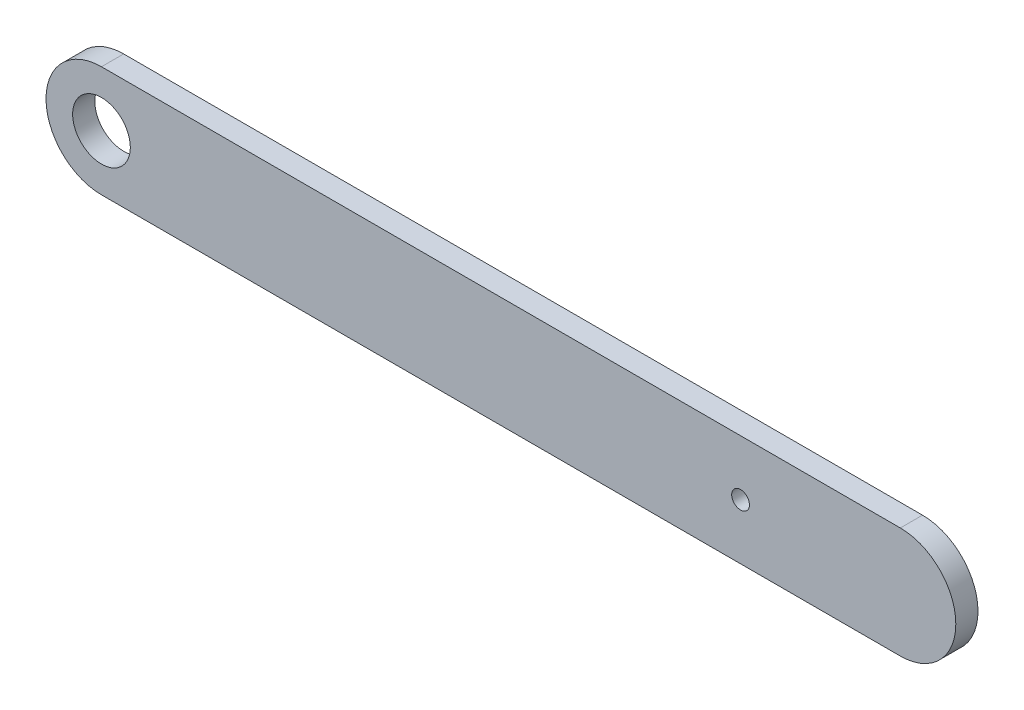
ISO-10303-21;
HEADER;
FILE_DESCRIPTION(('STEP AP214'),'2;1');
FILE_NAME('part.step','',(''),(''),'','','');
FILE_SCHEMA(('AUTOMOTIVE_DESIGN { 1 0 10303 214 1 1 1 1 }'));
ENDSEC;
DATA;
#1=APPLICATION_CONTEXT('core data for automotive mechanical design processes');
#2=APPLICATION_PROTOCOL_DEFINITION('international standard','automotive_design',2000,#1);
#3=PRODUCT_CONTEXT('',#1,'mechanical');
#4=PRODUCT('Part','Part','',(#3));
#5=PRODUCT_RELATED_PRODUCT_CATEGORY('part','',(#4));
#6=PRODUCT_DEFINITION_FORMATION('','',#4);
#7=PRODUCT_DEFINITION_CONTEXT('part definition',#1,'design');
#8=PRODUCT_DEFINITION('design','',#6,#7);
#9=PRODUCT_DEFINITION_SHAPE('','',#8);
#10=(LENGTH_UNIT() NAMED_UNIT(*) SI_UNIT(.MILLI.,.METRE.));
#11=(NAMED_UNIT(*) PLANE_ANGLE_UNIT() SI_UNIT($,.RADIAN.));
#12=(NAMED_UNIT(*) SI_UNIT($,.STERADIAN.) SOLID_ANGLE_UNIT());
#13=UNCERTAINTY_MEASURE_WITH_UNIT(LENGTH_MEASURE(1.E-05),#10,'distance_accuracy_value','');
#14=(GEOMETRIC_REPRESENTATION_CONTEXT(3) GLOBAL_UNCERTAINTY_ASSIGNED_CONTEXT((#13)) GLOBAL_UNIT_ASSIGNED_CONTEXT((#10,
#11,#12)) REPRESENTATION_CONTEXT('',''));
#15=CARTESIAN_POINT('',(0.,0.,0.));
#16=DIRECTION('',(0.,0.,1.));
#17=DIRECTION('',(1.,0.,0.));
#18=AXIS2_PLACEMENT_3D('',#15,#16,#17);
#19=CARTESIAN_POINT('',(0.,0.,5.));
#20=DIRECTION('',(0.,0.,1.));
#21=DIRECTION('',(1.,0.,0.));
#22=AXIS2_PLACEMENT_3D('',#19,#20,#21);
#23=PLANE('',#22);
#24=CARTESIAN_POINT('',(0.,0.,5.));
#25=DIRECTION('',(0.,0.,1.));
#26=DIRECTION('',(1.,0.,0.));
#27=AXIS2_PLACEMENT_3D('',#24,#25,#26);
#28=CIRCLE('',#27,6.5);
#29=CARTESIAN_POINT('',(6.5,0.,5.));
#30=VERTEX_POINT('',#29);
#31=EDGE_CURVE('E106',#30,#30,#28,.T.);
#32=ORIENTED_EDGE('',*,*,#31,.F.);
#33=EDGE_LOOP('',(#32));
#34=FACE_BOUND('',#33,.T.);
#35=CARTESIAN_POINT('',(0.,0.,5.));
#36=DIRECTION('',(0.,0.,1.));
#37=DIRECTION('',(1.,0.,0.));
#38=AXIS2_PLACEMENT_3D('',#35,#36,#37);
#39=CIRCLE('',#38,12.5);
#40=CARTESIAN_POINT('',(0.,12.5,5.));
#41=VERTEX_POINT('',#40);
#42=CARTESIAN_POINT('',(0.,-12.5,5.));
#43=VERTEX_POINT('',#42);
#44=EDGE_CURVE('E93',#41,#43,#39,.T.);
#45=ORIENTED_EDGE('',*,*,#44,.T.);
#46=DIRECTION('',(1.,0.,0.));
#47=VECTOR('',#46,1.);
#48=CARTESIAN_POINT('',(0.,-12.5,5.));
#49=LINE('',#48,#47);
#50=CARTESIAN_POINT('',(180.,-12.5,5.));
#51=VERTEX_POINT('',#50);
#52=EDGE_CURVE('E88',#43,#51,#49,.T.);
#53=ORIENTED_EDGE('',*,*,#52,.T.);
#54=CARTESIAN_POINT('',(180.,0.,5.));
#55=DIRECTION('',(0.,0.,1.));
#56=DIRECTION('',(1.,0.,0.));
#57=AXIS2_PLACEMENT_3D('',#54,#55,#56);
#58=CIRCLE('',#57,12.5);
#59=CARTESIAN_POINT('',(180.,12.5,5.));
#60=VERTEX_POINT('',#59);
#61=EDGE_CURVE('E90',#51,#60,#58,.T.);
#62=ORIENTED_EDGE('',*,*,#61,.T.);
#63=DIRECTION('',(-1.,0.,0.));
#64=VECTOR('',#63,1.);
#65=CARTESIAN_POINT('',(0.,12.5,5.));
#66=LINE('',#65,#64);
#67=EDGE_CURVE('E57',#60,#41,#66,.T.);
#68=ORIENTED_EDGE('',*,*,#67,.T.);
#69=EDGE_LOOP('',(#45,#53,#62,#68));
#70=FACE_BOUND('',#69,.T.);
#71=CARTESIAN_POINT('',(144.,0.,5.));
#72=DIRECTION('',(0.,0.,1.));
#73=DIRECTION('',(1.,0.,0.));
#74=AXIS2_PLACEMENT_3D('',#71,#72,#73);
#75=CIRCLE('',#74,2.00000000000011);
#76=CARTESIAN_POINT('',(146.,0.,5.));
#77=VERTEX_POINT('',#76);
#78=EDGE_CURVE('E122',#77,#77,#75,.T.);
#79=ORIENTED_EDGE('',*,*,#78,.F.);
#80=EDGE_LOOP('',(#79));
#81=FACE_BOUND('',#80,.T.);
#82=ADVANCED_FACE('F39',(#34,#70,#81),#23,.T.);
#83=CARTESIAN_POINT('',(0.,0.,0.));
#84=DIRECTION('',(0.,0.,1.));
#85=DIRECTION('',(1.,0.,0.));
#86=AXIS2_PLACEMENT_3D('',#83,#84,#85);
#87=PLANE('',#86);
#88=CARTESIAN_POINT('',(0.,0.,0.));
#89=DIRECTION('',(0.,0.,1.));
#90=DIRECTION('',(1.,0.,0.));
#91=AXIS2_PLACEMENT_3D('',#88,#89,#90);
#92=CIRCLE('',#91,12.5);
#93=CARTESIAN_POINT('',(0.,12.5,0.));
#94=VERTEX_POINT('',#93);
#95=CARTESIAN_POINT('',(0.,-12.5,0.));
#96=VERTEX_POINT('',#95);
#97=EDGE_CURVE('E103',#94,#96,#92,.T.);
#98=ORIENTED_EDGE('',*,*,#97,.F.);
#99=DIRECTION('',(-1.,0.,0.));
#100=VECTOR('',#99,1.);
#101=CARTESIAN_POINT('',(0.,12.5,0.));
#102=LINE('',#101,#100);
#103=CARTESIAN_POINT('',(180.,12.5,0.));
#104=VERTEX_POINT('',#103);
#105=EDGE_CURVE('E79',#104,#94,#102,.T.);
#106=ORIENTED_EDGE('',*,*,#105,.F.);
#107=CARTESIAN_POINT('',(180.,0.,0.));
#108=DIRECTION('',(0.,0.,1.));
#109=DIRECTION('',(1.,0.,0.));
#110=AXIS2_PLACEMENT_3D('',#107,#108,#109);
#111=CIRCLE('',#110,12.5);
#112=CARTESIAN_POINT('',(180.,-12.5,0.));
#113=VERTEX_POINT('',#112);
#114=EDGE_CURVE('E71',#113,#104,#111,.T.);
#115=ORIENTED_EDGE('',*,*,#114,.F.);
#116=DIRECTION('',(1.,0.,0.));
#117=VECTOR('',#116,1.);
#118=CARTESIAN_POINT('',(0.,-12.5,0.));
#119=LINE('',#118,#117);
#120=EDGE_CURVE('E92',#96,#113,#119,.T.);
#121=ORIENTED_EDGE('',*,*,#120,.F.);
#122=EDGE_LOOP('',(#98,#106,#115,#121));
#123=FACE_BOUND('',#122,.T.);
#124=CARTESIAN_POINT('',(0.,0.,0.));
#125=DIRECTION('',(0.,0.,1.));
#126=DIRECTION('',(1.,0.,0.));
#127=AXIS2_PLACEMENT_3D('',#124,#125,#126);
#128=CIRCLE('',#127,6.5);
#129=CARTESIAN_POINT('',(6.5,0.,0.));
#130=VERTEX_POINT('',#129);
#131=EDGE_CURVE('E116',#130,#130,#128,.T.);
#132=ORIENTED_EDGE('',*,*,#131,.T.);
#133=EDGE_LOOP('',(#132));
#134=FACE_BOUND('',#133,.T.);
#135=CARTESIAN_POINT('',(144.,0.,0.));
#136=DIRECTION('',(0.,0.,1.));
#137=DIRECTION('',(1.,0.,0.));
#138=AXIS2_PLACEMENT_3D('',#135,#136,#137);
#139=CIRCLE('',#138,2.00000000000011);
#140=CARTESIAN_POINT('',(146.,0.,0.));
#141=VERTEX_POINT('',#140);
#142=EDGE_CURVE('E124',#141,#141,#139,.T.);
#143=ORIENTED_EDGE('',*,*,#142,.T.);
#144=EDGE_LOOP('',(#143));
#145=FACE_BOUND('',#144,.T.);
#146=ADVANCED_FACE('F111',(#123,#134,#145),#87,.F.);
#147=CARTESIAN_POINT('',(0.,0.,5.));
#148=DIRECTION('',(0.,0.,-1.));
#149=DIRECTION('',(-1.,0.,0.));
#150=AXIS2_PLACEMENT_3D('',#147,#148,#149);
#151=CYLINDRICAL_SURFACE('',#150,12.5);
#152=ORIENTED_EDGE('',*,*,#97,.T.);
#153=DIRECTION('',(0.,0.,-1.));
#154=VECTOR('',#153,1.);
#155=CARTESIAN_POINT('',(0.,-12.5,5.));
#156=LINE('',#155,#154);
#157=EDGE_CURVE('E11',#43,#96,#156,.T.);
#158=ORIENTED_EDGE('',*,*,#157,.F.);
#159=ORIENTED_EDGE('',*,*,#44,.F.);
#160=DIRECTION('',(0.,0.,-1.));
#161=VECTOR('',#160,1.);
#162=CARTESIAN_POINT('',(0.,12.5,5.));
#163=LINE('',#162,#161);
#164=EDGE_CURVE('E97',#41,#94,#163,.T.);
#165=ORIENTED_EDGE('',*,*,#164,.T.);
#166=EDGE_LOOP('',(#152,#158,#159,#165));
#167=FACE_BOUND('',#166,.T.);
#168=ADVANCED_FACE('F41',(#167),#151,.T.);
#169=CARTESIAN_POINT('',(0.,-12.5,5.));
#170=DIRECTION('',(0.,1.,0.));
#171=DIRECTION('',(-1.,0.,0.));
#172=AXIS2_PLACEMENT_3D('',#169,#170,#171);
#173=PLANE('',#172);
#174=CARTESIAN_POINT('',(175.,-12.5,2.5));
#175=DIRECTION('',(0.,-1.,0.));
#176=DIRECTION('',(0.,0.,-1.));
#177=AXIS2_PLACEMENT_3D('',#174,#175,#176);
#178=CIRCLE('',#177,1.59999999999999);
#179=CARTESIAN_POINT('',(175.,-12.5,0.900000000000009));
#180=VERTEX_POINT('',#179);
#181=EDGE_CURVE('E128',#180,#180,#178,.T.);
#182=ORIENTED_EDGE('',*,*,#181,.F.);
#183=EDGE_LOOP('',(#182));
#184=FACE_BOUND('',#183,.T.);
#185=ORIENTED_EDGE('',*,*,#120,.T.);
#186=DIRECTION('',(0.,0.,-1.));
#187=VECTOR('',#186,1.);
#188=CARTESIAN_POINT('',(180.,-12.5,5.));
#189=LINE('',#188,#187);
#190=EDGE_CURVE('E48',#51,#113,#189,.T.);
#191=ORIENTED_EDGE('',*,*,#190,.F.);
#192=ORIENTED_EDGE('',*,*,#52,.F.);
#193=ORIENTED_EDGE('',*,*,#157,.T.);
#194=EDGE_LOOP('',(#185,#191,#192,#193));
#195=FACE_BOUND('',#194,.T.);
#196=ADVANCED_FACE('F94',(#184,#195),#173,.F.);
#197=CARTESIAN_POINT('',(180.,0.,5.));
#198=DIRECTION('',(0.,0.,-1.));
#199=DIRECTION('',(-1.,0.,0.));
#200=AXIS2_PLACEMENT_3D('',#197,#198,#199);
#201=CYLINDRICAL_SURFACE('',#200,12.5);
#202=ORIENTED_EDGE('',*,*,#114,.T.);
#203=DIRECTION('',(0.,0.,-1.));
#204=VECTOR('',#203,1.);
#205=CARTESIAN_POINT('',(180.,12.5,5.));
#206=LINE('',#205,#204);
#207=EDGE_CURVE('E96',#60,#104,#206,.T.);
#208=ORIENTED_EDGE('',*,*,#207,.F.);
#209=ORIENTED_EDGE('',*,*,#61,.F.);
#210=ORIENTED_EDGE('',*,*,#190,.T.);
#211=EDGE_LOOP('',(#202,#208,#209,#210));
#212=FACE_BOUND('',#211,.T.);
#213=ADVANCED_FACE('F100',(#212),#201,.T.);
#214=CARTESIAN_POINT('',(0.,12.5,5.));
#215=DIRECTION('',(0.,-1.,0.));
#216=DIRECTION('',(1.,0.,0.));
#217=AXIS2_PLACEMENT_3D('',#214,#215,#216);
#218=PLANE('',#217);
#219=ORIENTED_EDGE('',*,*,#105,.T.);
#220=ORIENTED_EDGE('',*,*,#164,.F.);
#221=ORIENTED_EDGE('',*,*,#67,.F.);
#222=ORIENTED_EDGE('',*,*,#207,.T.);
#223=EDGE_LOOP('',(#219,#220,#221,#222));
#224=FACE_BOUND('',#223,.T.);
#225=ADVANCED_FACE('F112',(#224),#218,.F.);
#226=CARTESIAN_POINT('',(0.,0.,5.));
#227=DIRECTION('',(0.,0.,-1.));
#228=DIRECTION('',(-1.,0.,0.));
#229=AXIS2_PLACEMENT_3D('',#226,#227,#228);
#230=CYLINDRICAL_SURFACE('',#229,6.5);
#231=ORIENTED_EDGE('',*,*,#31,.T.);
#232=EDGE_LOOP('',(#231));
#233=FACE_BOUND('',#232,.T.);
#234=ORIENTED_EDGE('',*,*,#131,.F.);
#235=EDGE_LOOP('',(#234));
#236=FACE_BOUND('',#235,.T.);
#237=ADVANCED_FACE('F161',(#233,#236),#230,.F.);
#238=CARTESIAN_POINT('',(144.,0.,5.));
#239=DIRECTION('',(0.,0.,-1.));
#240=DIRECTION('',(-1.,0.,0.));
#241=AXIS2_PLACEMENT_3D('',#238,#239,#240);
#242=CYLINDRICAL_SURFACE('',#241,2.00000000000011);
#243=ORIENTED_EDGE('',*,*,#78,.T.);
#244=EDGE_LOOP('',(#243));
#245=FACE_BOUND('',#244,.T.);
#246=ORIENTED_EDGE('',*,*,#142,.F.);
#247=EDGE_LOOP('',(#246));
#248=FACE_BOUND('',#247,.T.);
#249=ADVANCED_FACE('F143',(#245,#248),#242,.F.);
#250=CARTESIAN_POINT('',(175.,-2.5,2.5));
#251=DIRECTION('',(0.,-1.,0.));
#252=DIRECTION('',(0.,0.,-1.));
#253=AXIS2_PLACEMENT_3D('',#250,#251,#252);
#254=CYLINDRICAL_SURFACE('',#253,1.59999999999999);
#255=CARTESIAN_POINT('',(175.,-2.5,2.5));
#256=DIRECTION('',(0.,-1.,0.));
#257=DIRECTION('',(0.,0.,-1.));
#258=AXIS2_PLACEMENT_3D('',#255,#256,#257);
#259=CIRCLE('',#258,1.59999999999999);
#260=CARTESIAN_POINT('',(175.,-2.5,0.900000000000009));
#261=VERTEX_POINT('',#260);
#262=EDGE_CURVE('E130',#261,#261,#259,.T.);
#263=ORIENTED_EDGE('',*,*,#262,.F.);
#264=EDGE_LOOP('',(#263));
#265=FACE_BOUND('',#264,.T.);
#266=ORIENTED_EDGE('',*,*,#181,.T.);
#267=EDGE_LOOP('',(#266));
#268=FACE_BOUND('',#267,.T.);
#269=ADVANCED_FACE('F138',(#265,#268),#254,.F.);
#270=CARTESIAN_POINT('',(175.,-2.5,2.5));
#271=DIRECTION('',(0.,-1.,0.));
#272=DIRECTION('',(0.,0.,-1.));
#273=AXIS2_PLACEMENT_3D('',#270,#271,#272);
#274=PLANE('',#273);
#275=ORIENTED_EDGE('',*,*,#262,.T.);
#276=EDGE_LOOP('',(#275));
#277=FACE_BOUND('',#276,.T.);
#278=ADVANCED_FACE('F137',(#277),#274,.T.);
#279=CLOSED_SHELL('',(#82,#146,#168,#196,#213,#225,#237,#249,#269,#278));
#280=MANIFOLD_SOLID_BREP('B2',#279);
#281=ADVANCED_BREP_SHAPE_REPRESENTATION('',(#18,#280),#14);
#282=SHAPE_DEFINITION_REPRESENTATION(#9,#281);
ENDSEC;
END-ISO-10303-21;
